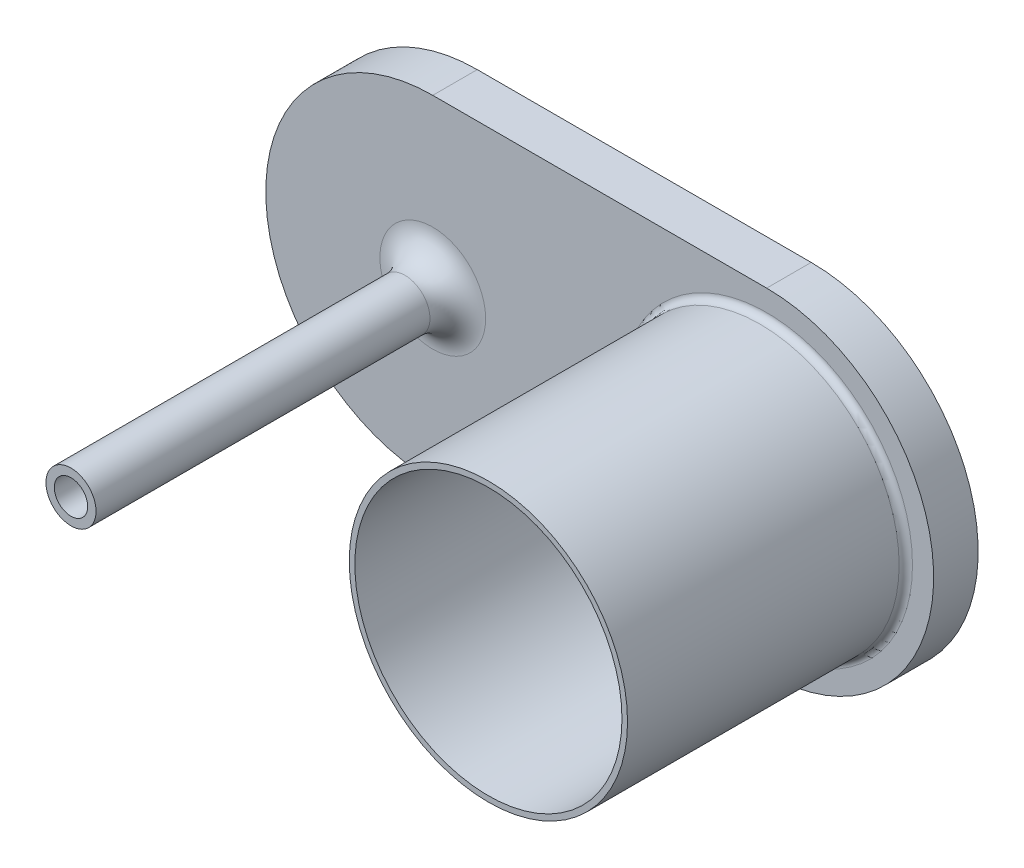
ISO-10303-21;
HEADER;
FILE_DESCRIPTION(('STEP AP214'),'2;1');
FILE_NAME('part.step','',(''),(''),'','','');
FILE_SCHEMA(('AUTOMOTIVE_DESIGN { 1 0 10303 214 1 1 1 1 }'));
ENDSEC;
DATA;
#1=APPLICATION_CONTEXT('core data for automotive mechanical design processes');
#2=APPLICATION_PROTOCOL_DEFINITION('international standard','automotive_design',2000,#1);
#3=PRODUCT_CONTEXT('',#1,'mechanical');
#4=PRODUCT('Part','Part','',(#3));
#5=PRODUCT_RELATED_PRODUCT_CATEGORY('part','',(#4));
#6=PRODUCT_DEFINITION_FORMATION('','',#4);
#7=PRODUCT_DEFINITION_CONTEXT('part definition',#1,'design');
#8=PRODUCT_DEFINITION('design','',#6,#7);
#9=PRODUCT_DEFINITION_SHAPE('','',#8);
#10=(LENGTH_UNIT() NAMED_UNIT(*) SI_UNIT(.MILLI.,.METRE.));
#11=(NAMED_UNIT(*) PLANE_ANGLE_UNIT() SI_UNIT($,.RADIAN.));
#12=(NAMED_UNIT(*) SI_UNIT($,.STERADIAN.) SOLID_ANGLE_UNIT());
#13=UNCERTAINTY_MEASURE_WITH_UNIT(LENGTH_MEASURE(1.E-05),#10,'distance_accuracy_value','');
#14=(GEOMETRIC_REPRESENTATION_CONTEXT(3) GLOBAL_UNCERTAINTY_ASSIGNED_CONTEXT((#13)) GLOBAL_UNIT_ASSIGNED_CONTEXT((#10,
#11,#12)) REPRESENTATION_CONTEXT('',''));
#15=CARTESIAN_POINT('',(0.,0.,0.));
#16=DIRECTION('',(0.,0.,1.));
#17=DIRECTION('',(1.,0.,0.));
#18=AXIS2_PLACEMENT_3D('',#15,#16,#17);
#19=CARTESIAN_POINT('',(30.,0.,2.5));
#20=DIRECTION('',(0.,0.,1.));
#21=DIRECTION('',(1.,0.,0.));
#22=AXIS2_PLACEMENT_3D('',#19,#20,#21);
#23=CYLINDRICAL_SURFACE('',#22,4.);
#24=DIRECTION('',(0.,0.,-1.));
#25=VECTOR('',#24,1.);
#26=CARTESIAN_POINT('',(30.,-4.,5.5));
#27=LINE('',#26,#25);
#28=CARTESIAN_POINT('',(30.,-4.,8.));
#29=VERTEX_POINT('',#28);
#30=CARTESIAN_POINT('',(30.,-4.,2.5));
#31=VERTEX_POINT('',#30);
#32=EDGE_CURVE('E169',#29,#31,#27,.T.);
#33=ORIENTED_EDGE('',*,*,#32,.F.);
#34=CARTESIAN_POINT('',(30.,0.,8.));
#35=DIRECTION('',(0.,0.,1.));
#36=DIRECTION('',(1.,0.,0.));
#37=AXIS2_PLACEMENT_3D('',#34,#35,#36);
#38=CIRCLE('',#37,4.);
#39=CARTESIAN_POINT('',(30.,4.,8.));
#40=VERTEX_POINT('',#39);
#41=EDGE_CURVE('E162',#29,#40,#38,.T.);
#42=ORIENTED_EDGE('',*,*,#41,.T.);
#43=DIRECTION('',(0.,0.,-1.));
#44=VECTOR('',#43,1.);
#45=CARTESIAN_POINT('',(30.,4.,5.5));
#46=LINE('',#45,#44);
#47=CARTESIAN_POINT('',(30.,4.,2.5));
#48=VERTEX_POINT('',#47);
#49=EDGE_CURVE('E143',#40,#48,#46,.T.);
#50=ORIENTED_EDGE('',*,*,#49,.T.);
#51=CARTESIAN_POINT('',(30.,0.,2.5));
#52=DIRECTION('',(0.,0.,1.));
#53=DIRECTION('',(1.,0.,0.));
#54=AXIS2_PLACEMENT_3D('',#51,#52,#53);
#55=CIRCLE('',#54,4.);
#56=EDGE_CURVE('E171',#31,#48,#55,.T.);
#57=ORIENTED_EDGE('',*,*,#56,.F.);
#58=EDGE_LOOP('',(#33,#42,#50,#57));
#59=FACE_BOUND('',#58,.T.);
#60=ADVANCED_FACE('F39',(#59),#23,.F.);
#61=CARTESIAN_POINT('',(-30.,0.,8.));
#62=DIRECTION('',(0.,0.,1.));
#63=DIRECTION('',(1.,0.,0.));
#64=AXIS2_PLACEMENT_3D('',#61,#62,#63);
#65=PLANE('',#64);
#66=DIRECTION('',(1.,0.,0.));
#67=VECTOR('',#66,1.);
#68=CARTESIAN_POINT('',(10.,-4.,8.));
#69=LINE('',#68,#67);
#70=CARTESIAN_POINT('',(10.4040820577346,-4.,8.));
#71=VERTEX_POINT('',#70);
#72=EDGE_CURVE('E166',#71,#29,#69,.T.);
#73=ORIENTED_EDGE('',*,*,#72,.F.);
#74=CARTESIAN_POINT('',(30.,0.,8.));
#75=DIRECTION('',(0.,0.,1.));
#76=DIRECTION('',(1.,0.,0.));
#77=AXIS2_PLACEMENT_3D('',#74,#75,#76);
#78=CIRCLE('',#77,20.);
#79=CARTESIAN_POINT('',(10.4040820577346,4.,8.));
#80=VERTEX_POINT('',#79);
#81=EDGE_CURVE('E164',#71,#80,#78,.T.);
#82=ORIENTED_EDGE('',*,*,#81,.T.);
#83=DIRECTION('',(-1.,0.,0.));
#84=VECTOR('',#83,1.);
#85=CARTESIAN_POINT('',(30.,4.,8.));
#86=LINE('',#85,#84);
#87=EDGE_CURVE('E146',#40,#80,#86,.T.);
#88=ORIENTED_EDGE('',*,*,#87,.F.);
#89=ORIENTED_EDGE('',*,*,#41,.F.);
#90=EDGE_LOOP('',(#73,#82,#88,#89));
#91=FACE_BOUND('',#90,.T.);
#92=ADVANCED_FACE('F161',(#91),#65,.T.);
#93=CARTESIAN_POINT('',(30.,0.,8.));
#94=DIRECTION('',(0.,0.,1.));
#95=DIRECTION('',(1.,0.,0.));
#96=AXIS2_PLACEMENT_3D('',#93,#94,#95);
#97=CIRCLE('',#96,26.2);
#98=CARTESIAN_POINT('',(56.2,0.,8.));
#99=VERTEX_POINT('',#98);
#100=EDGE_CURVE('E280',#99,#99,#97,.F.);
#101=ORIENTED_EDGE('',*,*,#100,.T.);
#102=EDGE_LOOP('',(#101));
#103=FACE_BOUND('',#102,.T.);
#104=CARTESIAN_POINT('',(-30.,0.,8.));
#105=DIRECTION('',(0.,0.,1.));
#106=DIRECTION('',(1.,0.,0.));
#107=AXIS2_PLACEMENT_3D('',#104,#105,#106);
#108=CIRCLE('',#107,9.5);
#109=CARTESIAN_POINT('',(-20.5,0.,8.));
#110=VERTEX_POINT('',#109);
#111=EDGE_CURVE('E272',#110,#110,#108,.F.);
#112=ORIENTED_EDGE('',*,*,#111,.T.);
#113=EDGE_LOOP('',(#112));
#114=FACE_BOUND('',#113,.T.);
#115=CARTESIAN_POINT('',(-30.,0.,8.));
#116=DIRECTION('',(0.,0.,1.));
#117=DIRECTION('',(1.,0.,0.));
#118=AXIS2_PLACEMENT_3D('',#115,#116,#117);
#119=CIRCLE('',#118,30.);
#120=CARTESIAN_POINT('',(-30.,30.,8.));
#121=VERTEX_POINT('',#120);
#122=CARTESIAN_POINT('',(-30.,-30.,8.));
#123=VERTEX_POINT('',#122);
#124=EDGE_CURVE('E223',#121,#123,#119,.T.);
#125=ORIENTED_EDGE('',*,*,#124,.T.);
#126=DIRECTION('',(1.,0.,0.));
#127=VECTOR('',#126,1.);
#128=CARTESIAN_POINT('',(-30.,-30.,8.));
#129=LINE('',#128,#127);
#130=CARTESIAN_POINT('',(30.,-30.,8.));
#131=VERTEX_POINT('',#130);
#132=EDGE_CURVE('E227',#123,#131,#129,.T.);
#133=ORIENTED_EDGE('',*,*,#132,.T.);
#134=CARTESIAN_POINT('',(30.,0.,8.));
#135=DIRECTION('',(0.,0.,1.));
#136=DIRECTION('',(1.,0.,0.));
#137=AXIS2_PLACEMENT_3D('',#134,#135,#136);
#138=CIRCLE('',#137,30.);
#139=CARTESIAN_POINT('',(30.,30.,8.));
#140=VERTEX_POINT('',#139);
#141=EDGE_CURVE('E231',#131,#140,#138,.T.);
#142=ORIENTED_EDGE('',*,*,#141,.T.);
#143=DIRECTION('',(-1.,0.,0.));
#144=VECTOR('',#143,1.);
#145=CARTESIAN_POINT('',(-30.,30.,8.));
#146=LINE('',#145,#144);
#147=EDGE_CURVE('E234',#140,#121,#146,.T.);
#148=ORIENTED_EDGE('',*,*,#147,.T.);
#149=EDGE_LOOP('',(#125,#133,#142,#148));
#150=FACE_BOUND('',#149,.T.);
#151=ADVANCED_FACE('F324',(#103,#114,#150),#65,.T.);
#152=CARTESIAN_POINT('',(-30.,-4.,5.5));
#153=DIRECTION('',(-1.,0.,0.));
#154=DIRECTION('',(0.,0.,1.));
#155=AXIS2_PLACEMENT_3D('',#152,#153,#154);
#156=PLANE('',#155);
#157=DIRECTION('',(0.,1.,0.));
#158=VECTOR('',#157,1.);
#159=CARTESIAN_POINT('',(-30.,-4.,2.5));
#160=LINE('',#159,#158);
#161=CARTESIAN_POINT('',(-30.,-4.,2.5));
#162=VERTEX_POINT('',#161);
#163=CARTESIAN_POINT('',(-30.,-3.,2.5));
#164=VERTEX_POINT('',#163);
#165=EDGE_CURVE('E213',#162,#164,#160,.T.);
#166=ORIENTED_EDGE('',*,*,#165,.T.);
#167=DIRECTION('',(0.,0.,1.));
#168=VECTOR('',#167,1.);
#169=CARTESIAN_POINT('',(-30.,-3.,2.5));
#170=LINE('',#169,#168);
#171=CARTESIAN_POINT('',(-30.,-3.,5.5));
#172=VERTEX_POINT('',#171);
#173=EDGE_CURVE('E186',#164,#172,#170,.T.);
#174=ORIENTED_EDGE('',*,*,#173,.T.);
#175=DIRECTION('',(0.,1.,0.));
#176=VECTOR('',#175,1.);
#177=CARTESIAN_POINT('',(-30.,-4.,5.5));
#178=LINE('',#177,#176);
#179=CARTESIAN_POINT('',(-30.,-4.,5.5));
#180=VERTEX_POINT('',#179);
#181=EDGE_CURVE('E219',#180,#172,#178,.T.);
#182=ORIENTED_EDGE('',*,*,#181,.F.);
#183=DIRECTION('',(0.,0.,1.));
#184=VECTOR('',#183,1.);
#185=CARTESIAN_POINT('',(-30.,-4.,5.5));
#186=LINE('',#185,#184);
#187=EDGE_CURVE('E191',#162,#180,#186,.T.);
#188=ORIENTED_EDGE('',*,*,#187,.F.);
#189=EDGE_LOOP('',(#166,#174,#182,#188));
#190=FACE_BOUND('',#189,.T.);
#191=ADVANCED_FACE('F322',(#190),#156,.F.);
#192=CARTESIAN_POINT('',(-30.,3.,5.5));
#193=VERTEX_POINT('',#192);
#194=CARTESIAN_POINT('',(-30.,4.,5.5));
#195=VERTEX_POINT('',#194);
#196=EDGE_CURVE('E204',#193,#195,#178,.T.);
#197=ORIENTED_EDGE('',*,*,#196,.F.);
#198=DIRECTION('',(0.,0.,1.));
#199=VECTOR('',#198,1.);
#200=CARTESIAN_POINT('',(-30.,3.,2.5));
#201=LINE('',#200,#199);
#202=CARTESIAN_POINT('',(-30.,3.,2.5));
#203=VERTEX_POINT('',#202);
#204=EDGE_CURVE('E176',#193,#203,#201,.F.);
#205=ORIENTED_EDGE('',*,*,#204,.T.);
#206=CARTESIAN_POINT('',(-30.,4.,2.5));
#207=VERTEX_POINT('',#206);
#208=EDGE_CURVE('E218',#203,#207,#160,.T.);
#209=ORIENTED_EDGE('',*,*,#208,.T.);
#210=DIRECTION('',(0.,0.,1.));
#211=VECTOR('',#210,1.);
#212=CARTESIAN_POINT('',(-30.,4.,5.5));
#213=LINE('',#212,#211);
#214=EDGE_CURVE('E190',#207,#195,#213,.T.);
#215=ORIENTED_EDGE('',*,*,#214,.T.);
#216=EDGE_LOOP('',(#197,#205,#209,#215));
#217=FACE_BOUND('',#216,.T.);
#218=ADVANCED_FACE('F315',(#217),#156,.F.);
#219=CARTESIAN_POINT('',(-30.,-4.,2.5));
#220=DIRECTION('',(0.,0.,-1.));
#221=DIRECTION('',(-1.,0.,0.));
#222=AXIS2_PLACEMENT_3D('',#219,#220,#221);
#223=PLANE('',#222);
#224=DIRECTION('',(-1.,0.,0.));
#225=VECTOR('',#224,1.);
#226=CARTESIAN_POINT('',(-30.,-4.,2.5));
#227=LINE('',#226,#225);
#228=EDGE_CURVE('E200',#31,#162,#227,.T.);
#229=ORIENTED_EDGE('',*,*,#228,.F.);
#230=ORIENTED_EDGE('',*,*,#56,.T.);
#231=DIRECTION('',(-1.,0.,0.));
#232=VECTOR('',#231,1.);
#233=CARTESIAN_POINT('',(-30.,4.,2.5));
#234=LINE('',#233,#232);
#235=EDGE_CURVE('E149',#48,#207,#234,.T.);
#236=ORIENTED_EDGE('',*,*,#235,.T.);
#237=ORIENTED_EDGE('',*,*,#208,.F.);
#238=CARTESIAN_POINT('',(-30.,0.,2.5));
#239=DIRECTION('',(0.,0.,1.));
#240=DIRECTION('',(1.,0.,0.));
#241=AXIS2_PLACEMENT_3D('',#238,#239,#240);
#242=CIRCLE('',#241,3.);
#243=EDGE_CURVE('E172',#203,#164,#242,.T.);
#244=ORIENTED_EDGE('',*,*,#243,.T.);
#245=ORIENTED_EDGE('',*,*,#165,.F.);
#246=EDGE_LOOP('',(#229,#230,#236,#237,#244,#245));
#247=FACE_BOUND('',#246,.T.);
#248=ADVANCED_FACE('F311',(#247),#223,.F.);
#249=CARTESIAN_POINT('',(-30.,-4.,5.5));
#250=DIRECTION('',(0.,0.,1.));
#251=DIRECTION('',(1.,0.,0.));
#252=AXIS2_PLACEMENT_3D('',#249,#250,#251);
#253=PLANE('',#252);
#254=DIRECTION('',(1.,0.,0.));
#255=VECTOR('',#254,1.);
#256=CARTESIAN_POINT('',(-30.,4.,5.5));
#257=LINE('',#256,#255);
#258=CARTESIAN_POINT('',(10.,4.,5.5));
#259=VERTEX_POINT('',#258);
#260=EDGE_CURVE('E155',#195,#259,#257,.T.);
#261=ORIENTED_EDGE('',*,*,#260,.T.);
#262=DIRECTION('',(0.,-1.,0.));
#263=VECTOR('',#262,1.);
#264=CARTESIAN_POINT('',(10.,-3.99999999999999,5.5));
#265=LINE('',#264,#263);
#266=CARTESIAN_POINT('',(10.,-4.,5.5));
#267=VERTEX_POINT('',#266);
#268=EDGE_CURVE('E394',#259,#267,#265,.T.);
#269=ORIENTED_EDGE('',*,*,#268,.T.);
#270=DIRECTION('',(1.,0.,0.));
#271=VECTOR('',#270,1.);
#272=CARTESIAN_POINT('',(-30.,-4.,5.5));
#273=LINE('',#272,#271);
#274=EDGE_CURVE('E195',#180,#267,#273,.T.);
#275=ORIENTED_EDGE('',*,*,#274,.F.);
#276=ORIENTED_EDGE('',*,*,#181,.T.);
#277=CARTESIAN_POINT('',(-30.,0.,5.5));
#278=DIRECTION('',(0.,0.,1.));
#279=DIRECTION('',(1.,0.,0.));
#280=AXIS2_PLACEMENT_3D('',#277,#278,#279);
#281=CIRCLE('',#280,3.);
#282=EDGE_CURVE('E264',#172,#193,#281,.T.);
#283=ORIENTED_EDGE('',*,*,#282,.T.);
#284=ORIENTED_EDGE('',*,*,#196,.T.);
#285=EDGE_LOOP('',(#261,#269,#275,#276,#283,#284));
#286=FACE_BOUND('',#285,.T.);
#287=ADVANCED_FACE('F314',(#286),#253,.F.);
#288=CARTESIAN_POINT('',(0.,-4.,0.));
#289=DIRECTION('',(0.,-1.,0.));
#290=DIRECTION('',(0.,0.,-1.));
#291=AXIS2_PLACEMENT_3D('',#288,#289,#290);
#292=PLANE('',#291);
#293=ORIENTED_EDGE('',*,*,#274,.T.);
#294=DIRECTION('',(0.,0.,1.));
#295=VECTOR('',#294,1.);
#296=CARTESIAN_POINT('',(10.,-4.,5.));
#297=LINE('',#296,#295);
#298=CARTESIAN_POINT('',(10.,-4.,8.01965803292663));
#299=VERTEX_POINT('',#298);
#300=EDGE_CURVE('E60',#267,#299,#297,.T.);
#301=ORIENTED_EDGE('',*,*,#300,.T.);
#302=CARTESIAN_POINT('',(10.,-4.,8.01965803292663));
#303=CARTESIAN_POINT('',(10.0671876550409,-4.,8.01310574516227));
#304=CARTESIAN_POINT('',(10.1344549952639,-4.,8.00819143186949));
#305=CARTESIAN_POINT('',(10.2691490145833,-4.,8.00163875575908));
#306=CARTESIAN_POINT('',(10.3365756936052,-4.,8.00000039140964));
#307=CARTESIAN_POINT('',(10.4040820577346,-4.,8.));
#308=B_SPLINE_CURVE_WITH_KNOTS('',3,(#302,#303,#304,#305,#306,#307),.UNSPECIFIED.,.F.,.F.,(4,2,
4),(0.,0.202339837457389,0.404679580303393),.UNSPECIFIED.);
#309=EDGE_CURVE('E11',#299,#71,#308,.T.);
#310=ORIENTED_EDGE('',*,*,#309,.T.);
#311=ORIENTED_EDGE('',*,*,#72,.T.);
#312=ORIENTED_EDGE('',*,*,#32,.T.);
#313=ORIENTED_EDGE('',*,*,#228,.T.);
#314=ORIENTED_EDGE('',*,*,#187,.T.);
#315=EDGE_LOOP('',(#293,#301,#310,#311,#312,#313,#314));
#316=FACE_BOUND('',#315,.T.);
#317=ADVANCED_FACE('F308',(#316),#292,.F.);
#318=CARTESIAN_POINT('',(0.,4.,0.));
#319=DIRECTION('',(0.,-1.,0.));
#320=DIRECTION('',(0.,0.,-1.));
#321=AXIS2_PLACEMENT_3D('',#318,#319,#320);
#322=PLANE('',#321);
#323=ORIENTED_EDGE('',*,*,#49,.F.);
#324=ORIENTED_EDGE('',*,*,#87,.T.);
#325=CARTESIAN_POINT('',(10.4040820577346,4.,8.));
#326=CARTESIAN_POINT('',(10.3365756936052,4.,8.00000039140964));
#327=CARTESIAN_POINT('',(10.2691490145832,4.,8.00163875575907));
#328=CARTESIAN_POINT('',(10.1344549952639,4.,8.00819143186949));
#329=CARTESIAN_POINT('',(10.0671876550409,4.,8.01310574516227));
#330=CARTESIAN_POINT('',(10.,4.,8.01965803292663));
#331=B_SPLINE_CURVE_WITH_KNOTS('',3,(#325,#326,#327,#328,#329,#330),.UNSPECIFIED.,.F.,.F.,(4,2,
4),(0.,0.202339742846006,0.404679580303395),.UNSPECIFIED.);
#332=CARTESIAN_POINT('',(10.,4.,8.01965803292663));
#333=VERTEX_POINT('',#332);
#334=EDGE_CURVE('E290',#80,#333,#331,.T.);
#335=ORIENTED_EDGE('',*,*,#334,.T.);
#336=DIRECTION('',(0.,0.,1.));
#337=VECTOR('',#336,1.);
#338=CARTESIAN_POINT('',(10.,4.,5.));
#339=LINE('',#338,#337);
#340=EDGE_CURVE('E68',#259,#333,#339,.T.);
#341=ORIENTED_EDGE('',*,*,#340,.F.);
#342=ORIENTED_EDGE('',*,*,#260,.F.);
#343=ORIENTED_EDGE('',*,*,#214,.F.);
#344=ORIENTED_EDGE('',*,*,#235,.F.);
#345=EDGE_LOOP('',(#323,#324,#335,#341,#342,#343,#344));
#346=FACE_BOUND('',#345,.T.);
#347=ADVANCED_FACE('F145',(#346),#322,.T.);
#348=CARTESIAN_POINT('',(-30.,0.,2.5));
#349=DIRECTION('',(0.,0.,1.));
#350=DIRECTION('',(1.,0.,0.));
#351=AXIS2_PLACEMENT_3D('',#348,#349,#350);
#352=CYLINDRICAL_SURFACE('',#351,3.);
#353=ORIENTED_EDGE('',*,*,#243,.F.);
#354=ORIENTED_EDGE('',*,*,#204,.F.);
#355=ORIENTED_EDGE('',*,*,#282,.F.);
#356=ORIENTED_EDGE('',*,*,#173,.F.);
#357=EDGE_LOOP('',(#353,#354,#355,#356));
#358=FACE_BOUND('',#357,.T.);
#359=CARTESIAN_POINT('',(-30.,0.,73.));
#360=DIRECTION('',(0.,0.,1.));
#361=DIRECTION('',(1.,0.,0.));
#362=AXIS2_PLACEMENT_3D('',#359,#360,#361);
#363=CIRCLE('',#362,3.);
#364=CARTESIAN_POINT('',(-27.,0.,73.));
#365=VERTEX_POINT('',#364);
#366=EDGE_CURVE('E379',#365,#365,#363,.T.);
#367=ORIENTED_EDGE('',*,*,#366,.T.);
#368=EDGE_LOOP('',(#367));
#369=FACE_BOUND('',#368,.T.);
#370=ADVANCED_FACE('F307',(#358,#369),#352,.F.);
#371=CARTESIAN_POINT('',(-30.,0.,8.));
#372=DIRECTION('',(0.,0.,-1.));
#373=DIRECTION('',(-1.,0.,0.));
#374=AXIS2_PLACEMENT_3D('',#371,#372,#373);
#375=CYLINDRICAL_SURFACE('',#374,30.);
#376=CARTESIAN_POINT('',(-30.,0.,0.));
#377=DIRECTION('',(0.,0.,1.));
#378=DIRECTION('',(1.,0.,0.));
#379=AXIS2_PLACEMENT_3D('',#376,#377,#378);
#380=CIRCLE('',#379,30.);
#381=CARTESIAN_POINT('',(-30.,30.,0.));
#382=VERTEX_POINT('',#381);
#383=CARTESIAN_POINT('',(-30.,-30.,0.));
#384=VERTEX_POINT('',#383);
#385=EDGE_CURVE('E217',#382,#384,#380,.T.);
#386=ORIENTED_EDGE('',*,*,#385,.T.);
#387=DIRECTION('',(0.,0.,-1.));
#388=VECTOR('',#387,1.);
#389=CARTESIAN_POINT('',(-30.,-30.,8.));
#390=LINE('',#389,#388);
#391=EDGE_CURVE('E260',#123,#384,#390,.T.);
#392=ORIENTED_EDGE('',*,*,#391,.F.);
#393=ORIENTED_EDGE('',*,*,#124,.F.);
#394=DIRECTION('',(0.,0.,-1.));
#395=VECTOR('',#394,1.);
#396=CARTESIAN_POINT('',(-30.,30.,8.));
#397=LINE('',#396,#395);
#398=EDGE_CURVE('E237',#121,#382,#397,.T.);
#399=ORIENTED_EDGE('',*,*,#398,.T.);
#400=EDGE_LOOP('',(#386,#392,#393,#399));
#401=FACE_BOUND('',#400,.T.);
#402=ADVANCED_FACE('F344',(#401),#375,.T.);
#403=CARTESIAN_POINT('',(-30.,-30.,8.));
#404=DIRECTION('',(0.,1.,0.));
#405=DIRECTION('',(-1.,0.,0.));
#406=AXIS2_PLACEMENT_3D('',#403,#404,#405);
#407=PLANE('',#406);
#408=DIRECTION('',(1.,0.,0.));
#409=VECTOR('',#408,1.);
#410=CARTESIAN_POINT('',(-30.,-30.,0.));
#411=LINE('',#410,#409);
#412=CARTESIAN_POINT('',(30.,-30.,0.));
#413=VERTEX_POINT('',#412);
#414=EDGE_CURVE('E241',#384,#413,#411,.T.);
#415=ORIENTED_EDGE('',*,*,#414,.T.);
#416=DIRECTION('',(0.,0.,-1.));
#417=VECTOR('',#416,1.);
#418=CARTESIAN_POINT('',(30.,-30.,8.));
#419=LINE('',#418,#417);
#420=EDGE_CURVE('E256',#131,#413,#419,.T.);
#421=ORIENTED_EDGE('',*,*,#420,.F.);
#422=ORIENTED_EDGE('',*,*,#132,.F.);
#423=ORIENTED_EDGE('',*,*,#391,.T.);
#424=EDGE_LOOP('',(#415,#421,#422,#423));
#425=FACE_BOUND('',#424,.T.);
#426=ADVANCED_FACE('F340',(#425),#407,.F.);
#427=CARTESIAN_POINT('',(30.,0.,8.));
#428=DIRECTION('',(0.,0.,-1.));
#429=DIRECTION('',(-1.,0.,0.));
#430=AXIS2_PLACEMENT_3D('',#427,#428,#429);
#431=CYLINDRICAL_SURFACE('',#430,30.);
#432=CARTESIAN_POINT('',(30.,0.,0.));
#433=DIRECTION('',(0.,0.,1.));
#434=DIRECTION('',(1.,0.,0.));
#435=AXIS2_PLACEMENT_3D('',#432,#433,#434);
#436=CIRCLE('',#435,30.);
#437=CARTESIAN_POINT('',(30.,30.,0.));
#438=VERTEX_POINT('',#437);
#439=EDGE_CURVE('E244',#413,#438,#436,.T.);
#440=ORIENTED_EDGE('',*,*,#439,.T.);
#441=DIRECTION('',(0.,0.,-1.));
#442=VECTOR('',#441,1.);
#443=CARTESIAN_POINT('',(30.,30.,8.));
#444=LINE('',#443,#442);
#445=EDGE_CURVE('E252',#140,#438,#444,.T.);
#446=ORIENTED_EDGE('',*,*,#445,.F.);
#447=ORIENTED_EDGE('',*,*,#141,.F.);
#448=ORIENTED_EDGE('',*,*,#420,.T.);
#449=EDGE_LOOP('',(#440,#446,#447,#448));
#450=FACE_BOUND('',#449,.T.);
#451=ADVANCED_FACE('F336',(#450),#431,.T.);
#452=CARTESIAN_POINT('',(-30.,30.,8.));
#453=DIRECTION('',(0.,-1.,0.));
#454=DIRECTION('',(1.,0.,0.));
#455=AXIS2_PLACEMENT_3D('',#452,#453,#454);
#456=PLANE('',#455);
#457=DIRECTION('',(-1.,0.,0.));
#458=VECTOR('',#457,1.);
#459=CARTESIAN_POINT('',(-30.,30.,0.));
#460=LINE('',#459,#458);
#461=EDGE_CURVE('E228',#438,#382,#460,.T.);
#462=ORIENTED_EDGE('',*,*,#461,.T.);
#463=ORIENTED_EDGE('',*,*,#398,.F.);
#464=ORIENTED_EDGE('',*,*,#147,.F.);
#465=ORIENTED_EDGE('',*,*,#445,.T.);
#466=EDGE_LOOP('',(#462,#463,#464,#465));
#467=FACE_BOUND('',#466,.T.);
#468=ADVANCED_FACE('F332',(#467),#456,.F.);
#469=CARTESIAN_POINT('',(-30.,0.,0.));
#470=DIRECTION('',(0.,0.,1.));
#471=DIRECTION('',(1.,0.,0.));
#472=AXIS2_PLACEMENT_3D('',#469,#470,#471);
#473=PLANE('',#472);
#474=ORIENTED_EDGE('',*,*,#385,.F.);
#475=ORIENTED_EDGE('',*,*,#461,.F.);
#476=ORIENTED_EDGE('',*,*,#439,.F.);
#477=ORIENTED_EDGE('',*,*,#414,.F.);
#478=EDGE_LOOP('',(#474,#475,#476,#477));
#479=FACE_BOUND('',#478,.T.);
#480=ADVANCED_FACE('F328',(#479),#473,.F.);
#481=CARTESIAN_POINT('',(-30.,0.,73.));
#482=DIRECTION('',(0.,0.,1.));
#483=DIRECTION('',(1.,0.,0.));
#484=AXIS2_PLACEMENT_3D('',#481,#482,#483);
#485=PLANE('',#484);
#486=CARTESIAN_POINT('',(-30.,0.,73.));
#487=DIRECTION('',(0.,0.,1.));
#488=DIRECTION('',(1.,0.,0.));
#489=AXIS2_PLACEMENT_3D('',#486,#487,#488);
#490=CIRCLE('',#489,4.5);
#491=CARTESIAN_POINT('',(-25.5,0.,73.));
#492=VERTEX_POINT('',#491);
#493=EDGE_CURVE('E179',#492,#492,#490,.T.);
#494=ORIENTED_EDGE('',*,*,#493,.T.);
#495=EDGE_LOOP('',(#494));
#496=FACE_BOUND('',#495,.T.);
#497=ORIENTED_EDGE('',*,*,#366,.F.);
#498=EDGE_LOOP('',(#497));
#499=FACE_BOUND('',#498,.T.);
#500=ADVANCED_FACE('F331',(#496,#499),#485,.T.);
#501=CARTESIAN_POINT('',(-30.,0.,73.));
#502=DIRECTION('',(0.,0.,-1.));
#503=DIRECTION('',(-1.,0.,0.));
#504=AXIS2_PLACEMENT_3D('',#501,#502,#503);
#505=CYLINDRICAL_SURFACE('',#504,4.5);
#506=CARTESIAN_POINT('',(-30.,0.,13.));
#507=DIRECTION('',(0.,0.,1.));
#508=DIRECTION('',(1.,0.,0.));
#509=AXIS2_PLACEMENT_3D('',#506,#507,#508);
#510=CIRCLE('',#509,4.5);
#511=CARTESIAN_POINT('',(-25.5,0.,13.));
#512=VERTEX_POINT('',#511);
#513=EDGE_CURVE('E268',#512,#512,#510,.T.);
#514=ORIENTED_EDGE('',*,*,#513,.T.);
#515=EDGE_LOOP('',(#514));
#516=FACE_BOUND('',#515,.T.);
#517=ORIENTED_EDGE('',*,*,#493,.F.);
#518=EDGE_LOOP('',(#517));
#519=FACE_BOUND('',#518,.T.);
#520=ADVANCED_FACE('F370',(#516,#519),#505,.T.);
#521=CARTESIAN_POINT('',(30.,0.,58.));
#522=DIRECTION('',(0.,0.,1.));
#523=DIRECTION('',(1.,0.,0.));
#524=AXIS2_PLACEMENT_3D('',#521,#522,#523);
#525=PLANE('',#524);
#526=CARTESIAN_POINT('',(30.,0.,58.));
#527=DIRECTION('',(0.,0.,1.));
#528=DIRECTION('',(1.,0.,0.));
#529=AXIS2_PLACEMENT_3D('',#526,#527,#528);
#530=CIRCLE('',#529,25.);
#531=CARTESIAN_POINT('',(55.,0.,58.));
#532=VERTEX_POINT('',#531);
#533=EDGE_CURVE('E382',#532,#532,#530,.T.);
#534=ORIENTED_EDGE('',*,*,#533,.T.);
#535=EDGE_LOOP('',(#534));
#536=FACE_BOUND('',#535,.T.);
#537=CARTESIAN_POINT('',(30.,0.,58.));
#538=DIRECTION('',(0.,0.,1.));
#539=DIRECTION('',(1.,0.,0.));
#540=AXIS2_PLACEMENT_3D('',#537,#538,#539);
#541=CIRCLE('',#540,24.);
#542=CARTESIAN_POINT('',(54.,0.,58.));
#543=VERTEX_POINT('',#542);
#544=EDGE_CURVE('E388',#543,#543,#541,.T.);
#545=ORIENTED_EDGE('',*,*,#544,.F.);
#546=EDGE_LOOP('',(#545));
#547=FACE_BOUND('',#546,.T.);
#548=ADVANCED_FACE('F425',(#536,#547),#525,.T.);
#549=CARTESIAN_POINT('',(30.,0.,58.));
#550=DIRECTION('',(0.,0.,-1.));
#551=DIRECTION('',(-1.,0.,0.));
#552=AXIS2_PLACEMENT_3D('',#549,#550,#551);
#553=CYLINDRICAL_SURFACE('',#552,25.);
#554=CARTESIAN_POINT('',(30.,0.,9.2));
#555=DIRECTION('',(0.,0.,1.));
#556=DIRECTION('',(1.,0.,0.));
#557=AXIS2_PLACEMENT_3D('',#554,#555,#556);
#558=CIRCLE('',#557,25.);
#559=CARTESIAN_POINT('',(55.,0.,9.2));
#560=VERTEX_POINT('',#559);
#561=EDGE_CURVE('E276',#560,#560,#558,.T.);
#562=ORIENTED_EDGE('',*,*,#561,.T.);
#563=EDGE_LOOP('',(#562));
#564=FACE_BOUND('',#563,.T.);
#565=ORIENTED_EDGE('',*,*,#533,.F.);
#566=EDGE_LOOP('',(#565));
#567=FACE_BOUND('',#566,.T.);
#568=ADVANCED_FACE('F423',(#564,#567),#553,.T.);
#569=CARTESIAN_POINT('',(30.,0.,58.));
#570=DIRECTION('',(0.,0.,-1.));
#571=DIRECTION('',(-1.,0.,0.));
#572=AXIS2_PLACEMENT_3D('',#569,#570,#571);
#573=CYLINDRICAL_SURFACE('',#572,24.);
#574=CARTESIAN_POINT('',(30.,0.,12.));
#575=DIRECTION('',(0.,0.,1.));
#576=DIRECTION('',(1.,0.,0.));
#577=AXIS2_PLACEMENT_3D('',#574,#575,#576);
#578=CIRCLE('',#577,24.);
#579=CARTESIAN_POINT('',(54.,0.,12.));
#580=VERTEX_POINT('',#579);
#581=EDGE_CURVE('E284',#580,#580,#578,.F.);
#582=ORIENTED_EDGE('',*,*,#581,.T.);
#583=EDGE_LOOP('',(#582));
#584=FACE_BOUND('',#583,.T.);
#585=ORIENTED_EDGE('',*,*,#544,.T.);
#586=EDGE_LOOP('',(#585));
#587=FACE_BOUND('',#586,.T.);
#588=ADVANCED_FACE('F352',(#584,#587),#573,.F.);
#589=CARTESIAN_POINT('',(-30.,0.,13.));
#590=DIRECTION('',(0.,0.,1.));
#591=DIRECTION('',(1.,0.,0.));
#592=AXIS2_PLACEMENT_3D('',#589,#590,#591);
#593=TOROIDAL_SURFACE('',#592,9.5,5.);
#594=ORIENTED_EDGE('',*,*,#111,.F.);
#595=EDGE_LOOP('',(#594));
#596=FACE_BOUND('',#595,.T.);
#597=ORIENTED_EDGE('',*,*,#513,.F.);
#598=EDGE_LOOP('',(#597));
#599=FACE_BOUND('',#598,.T.);
#600=ADVANCED_FACE('F349',(#596,#599),#593,.F.);
#601=CARTESIAN_POINT('',(10.,4.,5.));
#602=DIRECTION('',(-1.,0.,0.));
#603=DIRECTION('',(0.,-1.,0.));
#604=AXIS2_PLACEMENT_3D('',#601,#602,#603);
#605=PLANE('',#604);
#606=ORIENTED_EDGE('',*,*,#340,.T.);
#607=CARTESIAN_POINT('',(10.,4.,8.01965803292663));
#608=CARTESIAN_POINT('',(10.,3.83335340248197,8.01641042119758));
#609=CARTESIAN_POINT('',(10.,3.66669690223068,8.01375488055852));
#610=CARTESIAN_POINT('',(10.,3.33337385618924,8.0093744391532));
#611=CARTESIAN_POINT('',(10.,3.16670731058011,8.00764952487264));
#612=CARTESIAN_POINT('',(10.,2.66670621867122,8.00349042084089));
#613=CARTESIAN_POINT('',(10.,2.33336398351598,8.00207176739329));
#614=CARTESIAN_POINT('',(10.,1.66668810448256,8.00041632636409));
#615=CARTESIAN_POINT('',(10.,1.33335446062651,8.00017950553599));
#616=CARTESIAN_POINT('',(10.,0.83335069564489,8.00002729833377));
#617=CARTESIAN_POINT('',(10.,0.666680643080794,8.00001040074237));
#618=CARTESIAN_POINT('',(10.,0.333340386651393,7.99999936266003));
#619=CARTESIAN_POINT('',(10.,0.166670182786085,8.00000522218952));
#620=CARTESIAN_POINT('',(10.,0.,8.));
#621=B_SPLINE_CURVE_WITH_KNOTS('',3,(#607,#608,#609,#610,#611,#612,#613,#614,#615,#616,#617,
#618,#619,#620),.UNSPECIFIED.,.F.,.F.,(4,2,2,2,2,2,4),(0.,0.500031334068423,1.00005540662488,
2.00008484863905,3.00008615835284,3.50009629942931,4.00010688908193),.UNSPECIFIED.);
#622=CARTESIAN_POINT('',(10.,0.,8.));
#623=VERTEX_POINT('',#622);
#624=EDGE_CURVE('E298',#333,#623,#621,.T.);
#625=ORIENTED_EDGE('',*,*,#624,.T.);
#626=CARTESIAN_POINT('',(10.,0.,8.));
#627=CARTESIAN_POINT('',(10.,-0.166670182786094,8.00000522218952));
#628=CARTESIAN_POINT('',(10.,-0.333340386651402,7.99999936266003));
#629=CARTESIAN_POINT('',(10.,-0.666680643080803,8.00001040074237));
#630=CARTESIAN_POINT('',(10.,-0.833350695644897,8.00002729833377));
#631=CARTESIAN_POINT('',(10.,-1.33335446062652,8.00017950553599));
#632=CARTESIAN_POINT('',(10.,-1.66668810448257,8.00041632636409));
#633=CARTESIAN_POINT('',(10.,-2.33336398351598,8.00207176739329));
#634=CARTESIAN_POINT('',(10.,-2.66670621867123,8.00349042084089));
#635=CARTESIAN_POINT('',(10.,-3.16670731058011,8.00764952487264));
#636=CARTESIAN_POINT('',(10.,-3.33337385618924,8.0093744391532));
#637=CARTESIAN_POINT('',(10.,-3.66669690223068,8.01375488055852));
#638=CARTESIAN_POINT('',(10.,-3.83335340248197,8.01641042119758));
#639=CARTESIAN_POINT('',(10.,-4.,8.01965803292662));
#640=B_SPLINE_CURVE_WITH_KNOTS('',3,(#626,#627,#628,#629,#630,#631,#632,#633,#634,#635,#636,
#637,#638,#639),.UNSPECIFIED.,.F.,.F.,(4,2,2,2,2,2,4),(0.,0.500010589652624,1.00002073072909,
2.00002204044288,3.00005148245705,3.5000755550135,4.00010688908193),.UNSPECIFIED.);
#641=EDGE_CURVE('E54',#623,#299,#640,.T.);
#642=ORIENTED_EDGE('',*,*,#641,.T.);
#643=ORIENTED_EDGE('',*,*,#300,.F.);
#644=ORIENTED_EDGE('',*,*,#268,.F.);
#645=EDGE_LOOP('',(#606,#625,#642,#643,#644));
#646=FACE_BOUND('',#645,.T.);
#647=ADVANCED_FACE('F351',(#646),#605,.F.);
#648=CARTESIAN_POINT('',(30.,0.,9.2));
#649=DIRECTION('',(0.,0.,1.));
#650=DIRECTION('',(1.,0.,0.));
#651=AXIS2_PLACEMENT_3D('',#648,#649,#650);
#652=TOROIDAL_SURFACE('',#651,26.2,1.2);
#653=ORIENTED_EDGE('',*,*,#100,.F.);
#654=EDGE_LOOP('',(#653));
#655=FACE_BOUND('',#654,.T.);
#656=ORIENTED_EDGE('',*,*,#561,.F.);
#657=EDGE_LOOP('',(#656));
#658=FACE_BOUND('',#657,.T.);
#659=ADVANCED_FACE('F354',(#655,#658),#652,.F.);
#660=CARTESIAN_POINT('',(30.,0.,12.));
#661=DIRECTION('',(0.,0.,1.));
#662=DIRECTION('',(1.,0.,0.));
#663=AXIS2_PLACEMENT_3D('',#660,#661,#662);
#664=TOROIDAL_SURFACE('',#663,20.,4.);
#665=ORIENTED_EDGE('',*,*,#334,.F.);
#666=ORIENTED_EDGE('',*,*,#81,.F.);
#667=ORIENTED_EDGE('',*,*,#309,.F.);
#668=ORIENTED_EDGE('',*,*,#641,.F.);
#669=ORIENTED_EDGE('',*,*,#624,.F.);
#670=EDGE_LOOP('',(#665,#666,#667,#668,#669));
#671=FACE_BOUND('',#670,.T.);
#672=ORIENTED_EDGE('',*,*,#581,.F.);
#673=EDGE_LOOP('',(#672));
#674=FACE_BOUND('',#673,.T.);
#675=ADVANCED_FACE('F41',(#671,#674),#664,.F.);
#676=CLOSED_SHELL('',(#60,#92,#151,#191,#218,#248,#287,#317,#347,#370,#402,#426,#451,#468,#480,
#500,#520,#548,#568,#588,#600,#647,#659,#675));
#677=MANIFOLD_SOLID_BREP('B2',#676);
#678=ADVANCED_BREP_SHAPE_REPRESENTATION('',(#18,#677),#14);
#679=SHAPE_DEFINITION_REPRESENTATION(#9,#678);
ENDSEC;
END-ISO-10303-21;
